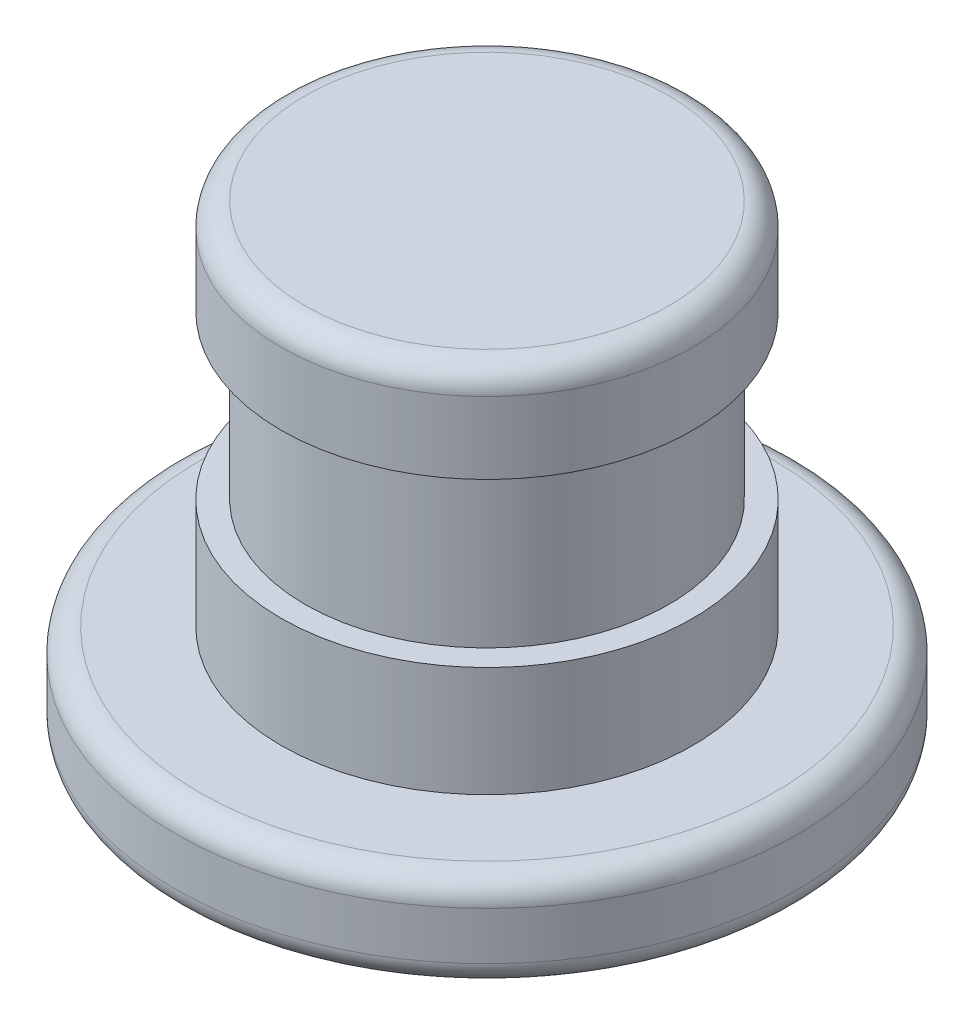
ISO-10303-21;
HEADER;
FILE_DESCRIPTION(('STEP AP214'),'2;1');
FILE_NAME('part.step','',(''),(''),'','','');
FILE_SCHEMA(('AUTOMOTIVE_DESIGN { 1 0 10303 214 1 1 1 1 }'));
ENDSEC;
DATA;
#1=APPLICATION_CONTEXT('core data for automotive mechanical design processes');
#2=APPLICATION_PROTOCOL_DEFINITION('international standard','automotive_design',2000,#1);
#3=PRODUCT_CONTEXT('',#1,'mechanical');
#4=PRODUCT('Part','Part','',(#3));
#5=PRODUCT_RELATED_PRODUCT_CATEGORY('part','',(#4));
#6=PRODUCT_DEFINITION_FORMATION('','',#4);
#7=PRODUCT_DEFINITION_CONTEXT('part definition',#1,'design');
#8=PRODUCT_DEFINITION('design','',#6,#7);
#9=PRODUCT_DEFINITION_SHAPE('','',#8);
#10=(LENGTH_UNIT() NAMED_UNIT(*) SI_UNIT(.MILLI.,.METRE.));
#11=(NAMED_UNIT(*) PLANE_ANGLE_UNIT() SI_UNIT($,.RADIAN.));
#12=(NAMED_UNIT(*) SI_UNIT($,.STERADIAN.) SOLID_ANGLE_UNIT());
#13=UNCERTAINTY_MEASURE_WITH_UNIT(LENGTH_MEASURE(1.E-05),#10,'distance_accuracy_value','');
#14=(GEOMETRIC_REPRESENTATION_CONTEXT(3) GLOBAL_UNCERTAINTY_ASSIGNED_CONTEXT((#13)) GLOBAL_UNIT_ASSIGNED_CONTEXT((#10,
#11,#12)) REPRESENTATION_CONTEXT('',''));
#15=CARTESIAN_POINT('',(0.,0.,0.));
#16=DIRECTION('',(0.,0.,1.));
#17=DIRECTION('',(1.,0.,0.));
#18=AXIS2_PLACEMENT_3D('',#15,#16,#17);
#19=CARTESIAN_POINT('',(0.,-2.,0.));
#20=DIRECTION('',(0.,1.,0.));
#21=DIRECTION('',(0.,0.,1.));
#22=AXIS2_PLACEMENT_3D('',#19,#20,#21);
#23=CYLINDRICAL_SURFACE('',#22,6.5);
#24=CARTESIAN_POINT('',(0.,-1.5,0.));
#25=DIRECTION('',(0.,1.,0.));
#26=DIRECTION('',(0.,0.,1.));
#27=AXIS2_PLACEMENT_3D('',#24,#25,#26);
#28=CIRCLE('',#27,6.5);
#29=CARTESIAN_POINT('',(0.,-1.5,6.5));
#30=VERTEX_POINT('',#29);
#31=EDGE_CURVE('E57',#30,#30,#28,.T.);
#32=ORIENTED_EDGE('',*,*,#31,.T.);
#33=EDGE_LOOP('',(#32));
#34=FACE_BOUND('',#33,.T.);
#35=CARTESIAN_POINT('',(0.,-0.5,0.));
#36=DIRECTION('',(0.,1.,0.));
#37=DIRECTION('',(0.,0.,1.));
#38=AXIS2_PLACEMENT_3D('',#35,#36,#37);
#39=CIRCLE('',#38,6.5);
#40=CARTESIAN_POINT('',(0.,-0.5,6.5));
#41=VERTEX_POINT('',#40);
#42=EDGE_CURVE('E60',#41,#41,#39,.F.);
#43=ORIENTED_EDGE('',*,*,#42,.T.);
#44=EDGE_LOOP('',(#43));
#45=FACE_BOUND('',#44,.T.);
#46=ADVANCED_FACE('F37',(#34,#45),#23,.T.);
#47=CARTESIAN_POINT('',(0.,-2.,0.));
#48=DIRECTION('',(0.,1.,0.));
#49=DIRECTION('',(0.,0.,1.));
#50=AXIS2_PLACEMENT_3D('',#47,#48,#49);
#51=PLANE('',#50);
#52=CARTESIAN_POINT('',(0.,-2.,0.));
#53=DIRECTION('',(0.,1.,0.));
#54=DIRECTION('',(0.,0.,1.));
#55=AXIS2_PLACEMENT_3D('',#52,#53,#54);
#56=CIRCLE('',#55,6.);
#57=CARTESIAN_POINT('',(0.,-2.,6.));
#58=VERTEX_POINT('',#57);
#59=EDGE_CURVE('E52',#58,#58,#56,.F.);
#60=ORIENTED_EDGE('',*,*,#59,.T.);
#61=EDGE_LOOP('',(#60));
#62=FACE_BOUND('',#61,.T.);
#63=ADVANCED_FACE('F98',(#62),#51,.F.);
#64=CARTESIAN_POINT('',(0.,0.,0.));
#65=DIRECTION('',(0.,1.,0.));
#66=DIRECTION('',(0.,0.,1.));
#67=AXIS2_PLACEMENT_3D('',#64,#65,#66);
#68=PLANE('',#67);
#69=CARTESIAN_POINT('',(0.,0.,0.));
#70=DIRECTION('',(0.,1.,0.));
#71=DIRECTION('',(0.,0.,1.));
#72=AXIS2_PLACEMENT_3D('',#69,#70,#71);
#73=CIRCLE('',#72,6.);
#74=CARTESIAN_POINT('',(0.,0.,6.));
#75=VERTEX_POINT('',#74);
#76=EDGE_CURVE('E48',#75,#75,#73,.T.);
#77=ORIENTED_EDGE('',*,*,#76,.T.);
#78=EDGE_LOOP('',(#77));
#79=FACE_BOUND('',#78,.T.);
#80=CARTESIAN_POINT('',(0.,0.,0.));
#81=DIRECTION('',(0.,1.,0.));
#82=DIRECTION('',(0.,0.,1.));
#83=AXIS2_PLACEMENT_3D('',#80,#81,#82);
#84=CIRCLE('',#83,4.3);
#85=CARTESIAN_POINT('',(0.,0.,4.3));
#86=VERTEX_POINT('',#85);
#87=EDGE_CURVE('E64',#86,#86,#84,.T.);
#88=ORIENTED_EDGE('',*,*,#87,.F.);
#89=EDGE_LOOP('',(#88));
#90=FACE_BOUND('',#89,.T.);
#91=ADVANCED_FACE('F104',(#79,#90),#68,.T.);
#92=CARTESIAN_POINT('',(0.,2.3,0.));
#93=DIRECTION('',(0.,-1.,0.));
#94=DIRECTION('',(0.,0.,-1.));
#95=AXIS2_PLACEMENT_3D('',#92,#93,#94);
#96=CYLINDRICAL_SURFACE('',#95,4.3);
#97=CARTESIAN_POINT('',(0.,2.3,0.));
#98=DIRECTION('',(0.,1.,0.));
#99=DIRECTION('',(0.,0.,1.));
#100=AXIS2_PLACEMENT_3D('',#97,#98,#99);
#101=CIRCLE('',#100,4.3);
#102=CARTESIAN_POINT('',(0.,2.3,4.3));
#103=VERTEX_POINT('',#102);
#104=EDGE_CURVE('E67',#103,#103,#101,.T.);
#105=ORIENTED_EDGE('',*,*,#104,.F.);
#106=EDGE_LOOP('',(#105));
#107=FACE_BOUND('',#106,.T.);
#108=ORIENTED_EDGE('',*,*,#87,.T.);
#109=EDGE_LOOP('',(#108));
#110=FACE_BOUND('',#109,.T.);
#111=ADVANCED_FACE('F121',(#107,#110),#96,.T.);
#112=CARTESIAN_POINT('',(0.,2.3,0.));
#113=DIRECTION('',(0.,1.,0.));
#114=DIRECTION('',(0.,0.,1.));
#115=AXIS2_PLACEMENT_3D('',#112,#113,#114);
#116=PLANE('',#115);
#117=CARTESIAN_POINT('',(0.,2.3,0.));
#118=DIRECTION('',(0.,1.,0.));
#119=DIRECTION('',(0.,0.,1.));
#120=AXIS2_PLACEMENT_3D('',#117,#118,#119);
#121=CIRCLE('',#120,3.8);
#122=CARTESIAN_POINT('',(0.,2.3,3.8));
#123=VERTEX_POINT('',#122);
#124=EDGE_CURVE('E63',#123,#123,#121,.T.);
#125=ORIENTED_EDGE('',*,*,#124,.F.);
#126=EDGE_LOOP('',(#125));
#127=FACE_BOUND('',#126,.T.);
#128=ORIENTED_EDGE('',*,*,#104,.T.);
#129=EDGE_LOOP('',(#128));
#130=FACE_BOUND('',#129,.T.);
#131=ADVANCED_FACE('F125',(#127,#130),#116,.T.);
#132=CARTESIAN_POINT('',(0.,5.7,0.));
#133=DIRECTION('',(0.,-1.,0.));
#134=DIRECTION('',(0.,0.,-1.));
#135=AXIS2_PLACEMENT_3D('',#132,#133,#134);
#136=CYLINDRICAL_SURFACE('',#135,3.8);
#137=CARTESIAN_POINT('',(0.,5.7,0.));
#138=DIRECTION('',(0.,1.,0.));
#139=DIRECTION('',(0.,0.,1.));
#140=AXIS2_PLACEMENT_3D('',#137,#138,#139);
#141=CIRCLE('',#140,3.8);
#142=CARTESIAN_POINT('',(0.,5.7,3.8));
#143=VERTEX_POINT('',#142);
#144=EDGE_CURVE('E70',#143,#143,#141,.T.);
#145=ORIENTED_EDGE('',*,*,#144,.F.);
#146=EDGE_LOOP('',(#145));
#147=FACE_BOUND('',#146,.T.);
#148=ORIENTED_EDGE('',*,*,#124,.T.);
#149=EDGE_LOOP('',(#148));
#150=FACE_BOUND('',#149,.T.);
#151=ADVANCED_FACE('F131',(#147,#150),#136,.T.);
#152=CARTESIAN_POINT('',(0.,7.7,0.));
#153=DIRECTION('',(0.,-1.,0.));
#154=DIRECTION('',(0.,0.,-1.));
#155=AXIS2_PLACEMENT_3D('',#152,#153,#154);
#156=CYLINDRICAL_SURFACE('',#155,4.3);
#157=CARTESIAN_POINT('',(0.,7.2,0.));
#158=DIRECTION('',(0.,1.,0.));
#159=DIRECTION('',(0.,0.,1.));
#160=AXIS2_PLACEMENT_3D('',#157,#158,#159);
#161=CIRCLE('',#160,4.3);
#162=CARTESIAN_POINT('',(0.,7.2,4.3));
#163=VERTEX_POINT('',#162);
#164=EDGE_CURVE('E10',#163,#163,#161,.F.);
#165=ORIENTED_EDGE('',*,*,#164,.T.);
#166=EDGE_LOOP('',(#165));
#167=FACE_BOUND('',#166,.T.);
#168=CARTESIAN_POINT('',(0.,5.7,0.));
#169=DIRECTION('',(0.,1.,0.));
#170=DIRECTION('',(0.,0.,1.));
#171=AXIS2_PLACEMENT_3D('',#168,#169,#170);
#172=CIRCLE('',#171,4.3);
#173=CARTESIAN_POINT('',(0.,5.7,4.3));
#174=VERTEX_POINT('',#173);
#175=EDGE_CURVE('E75',#174,#174,#172,.T.);
#176=ORIENTED_EDGE('',*,*,#175,.T.);
#177=EDGE_LOOP('',(#176));
#178=FACE_BOUND('',#177,.T.);
#179=ADVANCED_FACE('F79',(#167,#178),#156,.T.);
#180=CARTESIAN_POINT('',(0.,7.7,0.));
#181=DIRECTION('',(0.,1.,0.));
#182=DIRECTION('',(0.,0.,1.));
#183=AXIS2_PLACEMENT_3D('',#180,#181,#182);
#184=PLANE('',#183);
#185=CARTESIAN_POINT('',(0.,7.7,0.));
#186=DIRECTION('',(0.,1.,0.));
#187=DIRECTION('',(0.,0.,1.));
#188=AXIS2_PLACEMENT_3D('',#185,#186,#187);
#189=CIRCLE('',#188,3.8);
#190=CARTESIAN_POINT('',(0.,7.7,3.8));
#191=VERTEX_POINT('',#190);
#192=EDGE_CURVE('E44',#191,#191,#189,.T.);
#193=ORIENTED_EDGE('',*,*,#192,.T.);
#194=EDGE_LOOP('',(#193));
#195=FACE_BOUND('',#194,.T.);
#196=ADVANCED_FACE('F84',(#195),#184,.T.);
#197=CARTESIAN_POINT('',(0.,5.7,0.));
#198=DIRECTION('',(0.,1.,0.));
#199=DIRECTION('',(0.,0.,1.));
#200=AXIS2_PLACEMENT_3D('',#197,#198,#199);
#201=PLANE('',#200);
#202=ORIENTED_EDGE('',*,*,#144,.T.);
#203=EDGE_LOOP('',(#202));
#204=FACE_BOUND('',#203,.T.);
#205=ORIENTED_EDGE('',*,*,#175,.F.);
#206=EDGE_LOOP('',(#205));
#207=FACE_BOUND('',#206,.T.);
#208=ADVANCED_FACE('F81',(#204,#207),#201,.F.);
#209=CARTESIAN_POINT('',(0.,-1.5,0.));
#210=DIRECTION('',(0.,1.,0.));
#211=DIRECTION('',(0.,0.,1.));
#212=AXIS2_PLACEMENT_3D('',#209,#210,#211);
#213=TOROIDAL_SURFACE('',#212,6.,0.5);
#214=ORIENTED_EDGE('',*,*,#59,.F.);
#215=EDGE_LOOP('',(#214));
#216=FACE_BOUND('',#215,.T.);
#217=ORIENTED_EDGE('',*,*,#31,.F.);
#218=EDGE_LOOP('',(#217));
#219=FACE_BOUND('',#218,.T.);
#220=ADVANCED_FACE('F83',(#216,#219),#213,.T.);
#221=CARTESIAN_POINT('',(0.,-0.5,0.));
#222=DIRECTION('',(0.,1.,0.));
#223=DIRECTION('',(0.,0.,1.));
#224=AXIS2_PLACEMENT_3D('',#221,#222,#223);
#225=TOROIDAL_SURFACE('',#224,6.,0.5);
#226=ORIENTED_EDGE('',*,*,#42,.F.);
#227=EDGE_LOOP('',(#226));
#228=FACE_BOUND('',#227,.T.);
#229=ORIENTED_EDGE('',*,*,#76,.F.);
#230=EDGE_LOOP('',(#229));
#231=FACE_BOUND('',#230,.T.);
#232=ADVANCED_FACE('F92',(#228,#231),#225,.T.);
#233=CARTESIAN_POINT('',(0.,7.2,0.));
#234=DIRECTION('',(0.,1.,0.));
#235=DIRECTION('',(0.,0.,1.));
#236=AXIS2_PLACEMENT_3D('',#233,#234,#235);
#237=TOROIDAL_SURFACE('',#236,3.8,0.5);
#238=ORIENTED_EDGE('',*,*,#164,.F.);
#239=EDGE_LOOP('',(#238));
#240=FACE_BOUND('',#239,.T.);
#241=ORIENTED_EDGE('',*,*,#192,.F.);
#242=EDGE_LOOP('',(#241));
#243=FACE_BOUND('',#242,.T.);
#244=ADVANCED_FACE('F39',(#240,#243),#237,.T.);
#245=CLOSED_SHELL('',(#46,#63,#91,#111,#131,#151,#179,#196,#208,#220,#232,#244));
#246=MANIFOLD_SOLID_BREP('B2',#245);
#247=ADVANCED_BREP_SHAPE_REPRESENTATION('',(#18,#246),#14);
#248=SHAPE_DEFINITION_REPRESENTATION(#9,#247);
ENDSEC;
END-ISO-10303-21;
